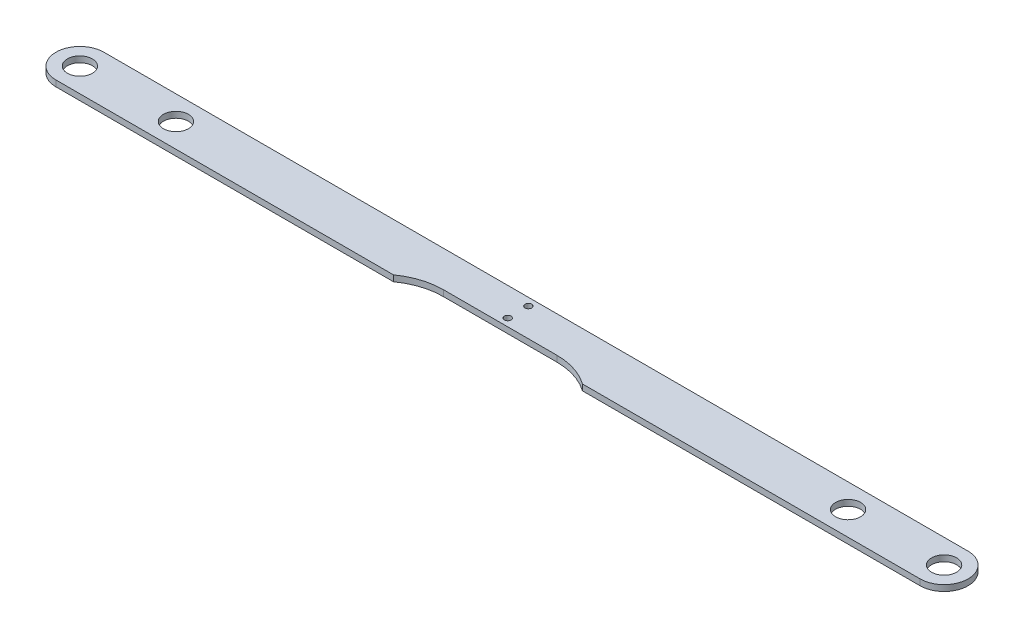
ISO-10303-21;
HEADER;
FILE_DESCRIPTION(('STEP AP214'),'2;1');
FILE_NAME('part.step','',(''),(''),'','','');
FILE_SCHEMA(('AUTOMOTIVE_DESIGN { 1 0 10303 214 1 1 1 1 }'));
ENDSEC;
DATA;
#1=APPLICATION_CONTEXT('core data for automotive mechanical design processes');
#2=APPLICATION_PROTOCOL_DEFINITION('international standard','automotive_design',2000,#1);
#3=PRODUCT_CONTEXT('',#1,'mechanical');
#4=PRODUCT('Part','Part','',(#3));
#5=PRODUCT_RELATED_PRODUCT_CATEGORY('part','',(#4));
#6=PRODUCT_DEFINITION_FORMATION('','',#4);
#7=PRODUCT_DEFINITION_CONTEXT('part definition',#1,'design');
#8=PRODUCT_DEFINITION('design','',#6,#7);
#9=PRODUCT_DEFINITION_SHAPE('','',#8);
#10=(LENGTH_UNIT() NAMED_UNIT(*) SI_UNIT(.MILLI.,.METRE.));
#11=(NAMED_UNIT(*) PLANE_ANGLE_UNIT() SI_UNIT($,.RADIAN.));
#12=(NAMED_UNIT(*) SI_UNIT($,.STERADIAN.) SOLID_ANGLE_UNIT());
#13=UNCERTAINTY_MEASURE_WITH_UNIT(LENGTH_MEASURE(1.E-05),#10,'distance_accuracy_value','');
#14=(GEOMETRIC_REPRESENTATION_CONTEXT(3) GLOBAL_UNCERTAINTY_ASSIGNED_CONTEXT((#13)) GLOBAL_UNIT_ASSIGNED_CONTEXT((#10,
#11,#12)) REPRESENTATION_CONTEXT('',''));
#15=CARTESIAN_POINT('',(0.,0.,0.));
#16=DIRECTION('',(0.,0.,1.));
#17=DIRECTION('',(1.,0.,0.));
#18=AXIS2_PLACEMENT_3D('',#15,#16,#17);
#19=CARTESIAN_POINT('',(-114.3,1.5875,1.60000000000002));
#20=DIRECTION('',(0.,1.,0.));
#21=DIRECTION('',(0.,0.,1.));
#22=AXIS2_PLACEMENT_3D('',#19,#20,#21);
#23=PLANE('',#22);
#24=CARTESIAN_POINT('',(0.,1.5875,-2.75));
#25=DIRECTION('',(0.,1.,0.));
#26=DIRECTION('',(0.,0.,1.));
#27=AXIS2_PLACEMENT_3D('',#24,#25,#26);
#28=CIRCLE('',#27,0.89);
#29=CARTESIAN_POINT('',(0.,1.5875,-1.86));
#30=VERTEX_POINT('',#29);
#31=EDGE_CURVE('E354',#30,#30,#28,.T.);
#32=ORIENTED_EDGE('',*,*,#31,.F.);
#33=EDGE_LOOP('',(#32));
#34=FACE_BOUND('',#33,.T.);
#35=CARTESIAN_POINT('',(0.,1.5875,2.75));
#36=DIRECTION('',(0.,1.,0.));
#37=DIRECTION('',(0.,0.,1.));
#38=AXIS2_PLACEMENT_3D('',#35,#36,#37);
#39=CIRCLE('',#38,0.89);
#40=CARTESIAN_POINT('',(0.,1.5875,3.64));
#41=VERTEX_POINT('',#40);
#42=EDGE_CURVE('E358',#41,#41,#39,.T.);
#43=ORIENTED_EDGE('',*,*,#42,.F.);
#44=EDGE_LOOP('',(#43));
#45=FACE_BOUND('',#44,.T.);
#46=CARTESIAN_POINT('',(-88.9,1.5875,1.60000000000002));
#47=DIRECTION('',(0.,1.,0.));
#48=DIRECTION('',(0.,0.,1.));
#49=AXIS2_PLACEMENT_3D('',#46,#47,#48);
#50=CIRCLE('',#49,3.302);
#51=CARTESIAN_POINT('',(-88.9,1.5875,4.90200000000002));
#52=VERTEX_POINT('',#51);
#53=EDGE_CURVE('E156',#52,#52,#50,.T.);
#54=ORIENTED_EDGE('',*,*,#53,.F.);
#55=EDGE_LOOP('',(#54));
#56=FACE_BOUND('',#55,.T.);
#57=CARTESIAN_POINT('',(-114.3,1.5875,1.60000000000002));
#58=DIRECTION('',(0.,1.,0.));
#59=DIRECTION('',(0.,0.,1.));
#60=AXIS2_PLACEMENT_3D('',#57,#58,#59);
#61=CIRCLE('',#60,6.35000000000001);
#62=CARTESIAN_POINT('',(-114.3,1.5875,-4.74999999999999));
#63=VERTEX_POINT('',#62);
#64=CARTESIAN_POINT('',(-114.3,1.5875,7.95000000000003));
#65=VERTEX_POINT('',#64);
#66=EDGE_CURVE('E162',#63,#65,#61,.T.);
#67=ORIENTED_EDGE('',*,*,#66,.T.);
#68=DIRECTION('',(1.,0.,0.));
#69=VECTOR('',#68,1.);
#70=CARTESIAN_POINT('',(-114.3,1.5875,7.95000000000003));
#71=LINE('',#70,#69);
#72=CARTESIAN_POINT('',(-25.,1.5875,7.94999999999997));
#73=VERTEX_POINT('',#72);
#74=EDGE_CURVE('E83',#65,#73,#71,.T.);
#75=ORIENTED_EDGE('',*,*,#74,.T.);
#76=CARTESIAN_POINT('',(-15.,1.5875,21.9750000000003));
#77=DIRECTION('',(0.,-1.,0.));
#78=DIRECTION('',(0.,0.,1.));
#79=AXIS2_PLACEMENT_3D('',#76,#77,#78);
#80=CIRCLE('',#79,17.2250000000003);
#81=CARTESIAN_POINT('',(-15.,1.5875,4.75000000000001));
#82=VERTEX_POINT('',#81);
#83=EDGE_CURVE('E165',#73,#82,#80,.T.);
#84=ORIENTED_EDGE('',*,*,#83,.T.);
#85=DIRECTION('',(1.,0.,0.));
#86=VECTOR('',#85,1.);
#87=CARTESIAN_POINT('',(-15.,1.5875,4.75000000000001));
#88=LINE('',#87,#86);
#89=CARTESIAN_POINT('',(15.,1.5875,4.75000000000001));
#90=VERTEX_POINT('',#89);
#91=EDGE_CURVE('E111',#82,#90,#88,.T.);
#92=ORIENTED_EDGE('',*,*,#91,.T.);
#93=CARTESIAN_POINT('',(15.,1.5875,21.9750000000003));
#94=DIRECTION('',(0.,1.,0.));
#95=DIRECTION('',(0.,0.,1.));
#96=AXIS2_PLACEMENT_3D('',#93,#94,#95);
#97=CIRCLE('',#96,17.2250000000003);
#98=CARTESIAN_POINT('',(25.,1.5875,7.94999999999997));
#99=VERTEX_POINT('',#98);
#100=EDGE_CURVE('E127',#99,#90,#97,.T.);
#101=ORIENTED_EDGE('',*,*,#100,.F.);
#102=DIRECTION('',(-1.,0.,0.));
#103=VECTOR('',#102,1.);
#104=CARTESIAN_POINT('',(114.3,1.5875,7.95000000000003));
#105=LINE('',#104,#103);
#106=CARTESIAN_POINT('',(114.3,1.5875,7.95000000000003));
#107=VERTEX_POINT('',#106);
#108=EDGE_CURVE('E126',#107,#99,#105,.T.);
#109=ORIENTED_EDGE('',*,*,#108,.F.);
#110=CARTESIAN_POINT('',(114.3,1.5875,1.60000000000002));
#111=DIRECTION('',(0.,-1.,0.));
#112=DIRECTION('',(0.,0.,1.));
#113=AXIS2_PLACEMENT_3D('',#110,#111,#112);
#114=CIRCLE('',#113,6.35000000000001);
#115=CARTESIAN_POINT('',(114.3,1.5875,-4.74999999999999));
#116=VERTEX_POINT('',#115);
#117=EDGE_CURVE('E116',#116,#107,#114,.T.);
#118=ORIENTED_EDGE('',*,*,#117,.F.);
#119=DIRECTION('',(-1.,0.,0.));
#120=VECTOR('',#119,1.);
#121=CARTESIAN_POINT('',(0.,1.5875,-4.74999999999999));
#122=LINE('',#121,#120);
#123=EDGE_CURVE('E50',#116,#63,#122,.T.);
#124=ORIENTED_EDGE('',*,*,#123,.T.);
#125=EDGE_LOOP('',(#67,#75,#84,#92,#101,#109,#118,#124));
#126=FACE_BOUND('',#125,.T.);
#127=CARTESIAN_POINT('',(-114.3,1.5875,1.60000000000002));
#128=DIRECTION('',(0.,1.,0.));
#129=DIRECTION('',(0.,0.,1.));
#130=AXIS2_PLACEMENT_3D('',#127,#128,#129);
#131=CIRCLE('',#130,3.302);
#132=CARTESIAN_POINT('',(-114.3,1.5875,4.90200000000002));
#133=VERTEX_POINT('',#132);
#134=EDGE_CURVE('E150',#133,#133,#131,.T.);
#135=ORIENTED_EDGE('',*,*,#134,.F.);
#136=EDGE_LOOP('',(#135));
#137=FACE_BOUND('',#136,.T.);
#138=CARTESIAN_POINT('',(114.3,1.5875,1.60000000000002));
#139=DIRECTION('',(0.,-1.,0.));
#140=DIRECTION('',(0.,0.,1.));
#141=AXIS2_PLACEMENT_3D('',#138,#139,#140);
#142=CIRCLE('',#141,3.302);
#143=CARTESIAN_POINT('',(114.3,1.5875,4.90200000000002));
#144=VERTEX_POINT('',#143);
#145=EDGE_CURVE('E368',#144,#144,#142,.T.);
#146=ORIENTED_EDGE('',*,*,#145,.T.);
#147=EDGE_LOOP('',(#146));
#148=FACE_BOUND('',#147,.T.);
#149=CARTESIAN_POINT('',(88.9,1.5875,1.60000000000002));
#150=DIRECTION('',(0.,-1.,0.));
#151=DIRECTION('',(0.,0.,1.));
#152=AXIS2_PLACEMENT_3D('',#149,#150,#151);
#153=CIRCLE('',#152,3.302);
#154=CARTESIAN_POINT('',(88.9,1.5875,4.90200000000002));
#155=VERTEX_POINT('',#154);
#156=EDGE_CURVE('E142',#155,#155,#153,.T.);
#157=ORIENTED_EDGE('',*,*,#156,.T.);
#158=EDGE_LOOP('',(#157));
#159=FACE_BOUND('',#158,.T.);
#160=ADVANCED_FACE('F33',(#34,#45,#56,#126,#137,#148,#159),#23,.T.);
#161=CARTESIAN_POINT('',(-114.3,0.,1.60000000000002));
#162=DIRECTION('',(0.,1.,0.));
#163=DIRECTION('',(0.,0.,1.));
#164=AXIS2_PLACEMENT_3D('',#161,#162,#163);
#165=PLANE('',#164);
#166=CARTESIAN_POINT('',(0.,0.,-2.75));
#167=DIRECTION('',(0.,1.,0.));
#168=DIRECTION('',(0.,0.,1.));
#169=AXIS2_PLACEMENT_3D('',#166,#167,#168);
#170=CIRCLE('',#169,0.89);
#171=CARTESIAN_POINT('',(0.,0.,-1.86));
#172=VERTEX_POINT('',#171);
#173=EDGE_CURVE('E357',#172,#172,#170,.T.);
#174=ORIENTED_EDGE('',*,*,#173,.T.);
#175=EDGE_LOOP('',(#174));
#176=FACE_BOUND('',#175,.T.);
#177=CARTESIAN_POINT('',(0.,0.,2.75));
#178=DIRECTION('',(0.,1.,0.));
#179=DIRECTION('',(0.,0.,1.));
#180=AXIS2_PLACEMENT_3D('',#177,#178,#179);
#181=CIRCLE('',#180,0.89);
#182=CARTESIAN_POINT('',(0.,0.,3.64));
#183=VERTEX_POINT('',#182);
#184=EDGE_CURVE('E363',#183,#183,#181,.T.);
#185=ORIENTED_EDGE('',*,*,#184,.T.);
#186=EDGE_LOOP('',(#185));
#187=FACE_BOUND('',#186,.T.);
#188=CARTESIAN_POINT('',(-114.3,0.,1.60000000000002));
#189=DIRECTION('',(0.,1.,0.));
#190=DIRECTION('',(0.,0.,1.));
#191=AXIS2_PLACEMENT_3D('',#188,#189,#190);
#192=CIRCLE('',#191,6.35000000000001);
#193=CARTESIAN_POINT('',(-114.3,0.,-4.74999999999999));
#194=VERTEX_POINT('',#193);
#195=CARTESIAN_POINT('',(-114.3,0.,7.95000000000003));
#196=VERTEX_POINT('',#195);
#197=EDGE_CURVE('E159',#194,#196,#192,.T.);
#198=ORIENTED_EDGE('',*,*,#197,.F.);
#199=DIRECTION('',(-1.,0.,0.));
#200=VECTOR('',#199,1.);
#201=CARTESIAN_POINT('',(0.,0.,-4.74999999999999));
#202=LINE('',#201,#200);
#203=CARTESIAN_POINT('',(114.3,0.,-4.74999999999999));
#204=VERTEX_POINT('',#203);
#205=EDGE_CURVE('E76',#204,#194,#202,.T.);
#206=ORIENTED_EDGE('',*,*,#205,.F.);
#207=CARTESIAN_POINT('',(114.3,0.,1.60000000000002));
#208=DIRECTION('',(0.,-1.,0.));
#209=DIRECTION('',(0.,0.,1.));
#210=AXIS2_PLACEMENT_3D('',#207,#208,#209);
#211=CIRCLE('',#210,6.35000000000001);
#212=CARTESIAN_POINT('',(114.3,0.,7.95000000000003));
#213=VERTEX_POINT('',#212);
#214=EDGE_CURVE('E119',#204,#213,#211,.T.);
#215=ORIENTED_EDGE('',*,*,#214,.T.);
#216=DIRECTION('',(-1.,0.,0.));
#217=VECTOR('',#216,1.);
#218=CARTESIAN_POINT('',(114.3,0.,7.95000000000003));
#219=LINE('',#218,#217);
#220=CARTESIAN_POINT('',(25.,0.,7.94999999999997));
#221=VERTEX_POINT('',#220);
#222=EDGE_CURVE('E128',#213,#221,#219,.T.);
#223=ORIENTED_EDGE('',*,*,#222,.T.);
#224=CARTESIAN_POINT('',(15.,0.,21.9750000000003));
#225=DIRECTION('',(0.,1.,0.));
#226=DIRECTION('',(0.,0.,1.));
#227=AXIS2_PLACEMENT_3D('',#224,#225,#226);
#228=CIRCLE('',#227,17.2250000000003);
#229=CARTESIAN_POINT('',(15.,0.,4.75000000000001));
#230=VERTEX_POINT('',#229);
#231=EDGE_CURVE('E133',#221,#230,#228,.T.);
#232=ORIENTED_EDGE('',*,*,#231,.T.);
#233=DIRECTION('',(1.,0.,0.));
#234=VECTOR('',#233,1.);
#235=CARTESIAN_POINT('',(-15.,0.,4.75000000000001));
#236=LINE('',#235,#234);
#237=CARTESIAN_POINT('',(-15.,0.,4.75000000000001));
#238=VERTEX_POINT('',#237);
#239=EDGE_CURVE('E173',#238,#230,#236,.T.);
#240=ORIENTED_EDGE('',*,*,#239,.F.);
#241=CARTESIAN_POINT('',(-15.,0.,21.9750000000003));
#242=DIRECTION('',(0.,-1.,0.));
#243=DIRECTION('',(0.,0.,1.));
#244=AXIS2_PLACEMENT_3D('',#241,#242,#243);
#245=CIRCLE('',#244,17.2250000000003);
#246=CARTESIAN_POINT('',(-25.,0.,7.94999999999997));
#247=VERTEX_POINT('',#246);
#248=EDGE_CURVE('E69',#247,#238,#245,.T.);
#249=ORIENTED_EDGE('',*,*,#248,.F.);
#250=DIRECTION('',(1.,0.,0.));
#251=VECTOR('',#250,1.);
#252=CARTESIAN_POINT('',(-114.3,0.,7.95000000000003));
#253=LINE('',#252,#251);
#254=EDGE_CURVE('E170',#196,#247,#253,.T.);
#255=ORIENTED_EDGE('',*,*,#254,.F.);
#256=EDGE_LOOP('',(#198,#206,#215,#223,#232,#240,#249,#255));
#257=FACE_BOUND('',#256,.T.);
#258=CARTESIAN_POINT('',(-88.9,0.,1.60000000000002));
#259=DIRECTION('',(0.,1.,0.));
#260=DIRECTION('',(0.,0.,1.));
#261=AXIS2_PLACEMENT_3D('',#258,#259,#260);
#262=CIRCLE('',#261,3.302);
#263=CARTESIAN_POINT('',(-88.9,0.,4.90200000000002));
#264=VERTEX_POINT('',#263);
#265=EDGE_CURVE('E153',#264,#264,#262,.T.);
#266=ORIENTED_EDGE('',*,*,#265,.T.);
#267=EDGE_LOOP('',(#266));
#268=FACE_BOUND('',#267,.T.);
#269=CARTESIAN_POINT('',(-114.3,0.,1.60000000000002));
#270=DIRECTION('',(0.,1.,0.));
#271=DIRECTION('',(0.,0.,1.));
#272=AXIS2_PLACEMENT_3D('',#269,#270,#271);
#273=CIRCLE('',#272,3.302);
#274=CARTESIAN_POINT('',(-114.3,0.,4.90200000000002));
#275=VERTEX_POINT('',#274);
#276=EDGE_CURVE('E120',#275,#275,#273,.T.);
#277=ORIENTED_EDGE('',*,*,#276,.T.);
#278=EDGE_LOOP('',(#277));
#279=FACE_BOUND('',#278,.T.);
#280=CARTESIAN_POINT('',(114.3,0.,1.60000000000002));
#281=DIRECTION('',(0.,-1.,0.));
#282=DIRECTION('',(0.,0.,1.));
#283=AXIS2_PLACEMENT_3D('',#280,#281,#282);
#284=CIRCLE('',#283,3.302);
#285=CARTESIAN_POINT('',(114.3,0.,4.90200000000002));
#286=VERTEX_POINT('',#285);
#287=EDGE_CURVE('E360',#286,#286,#284,.T.);
#288=ORIENTED_EDGE('',*,*,#287,.F.);
#289=EDGE_LOOP('',(#288));
#290=FACE_BOUND('',#289,.T.);
#291=CARTESIAN_POINT('',(88.9,0.,1.60000000000002));
#292=DIRECTION('',(0.,-1.,0.));
#293=DIRECTION('',(0.,0.,1.));
#294=AXIS2_PLACEMENT_3D('',#291,#292,#293);
#295=CIRCLE('',#294,3.302);
#296=CARTESIAN_POINT('',(88.9,0.,4.90200000000002));
#297=VERTEX_POINT('',#296);
#298=EDGE_CURVE('E136',#297,#297,#295,.T.);
#299=ORIENTED_EDGE('',*,*,#298,.F.);
#300=EDGE_LOOP('',(#299));
#301=FACE_BOUND('',#300,.T.);
#302=ADVANCED_FACE('F183',(#176,#187,#257,#268,#279,#290,#301),#165,.F.);
#303=CARTESIAN_POINT('',(-114.3,1.5875,1.60000000000002));
#304=DIRECTION('',(0.,-1.,0.));
#305=DIRECTION('',(0.,0.,-1.));
#306=AXIS2_PLACEMENT_3D('',#303,#304,#305);
#307=CYLINDRICAL_SURFACE('',#306,6.35000000000001);
#308=ORIENTED_EDGE('',*,*,#197,.T.);
#309=DIRECTION('',(0.,-1.,0.));
#310=VECTOR('',#309,1.);
#311=CARTESIAN_POINT('',(-114.3,1.5875,7.95000000000003));
#312=LINE('',#311,#310);
#313=EDGE_CURVE('E11',#65,#196,#312,.T.);
#314=ORIENTED_EDGE('',*,*,#313,.F.);
#315=ORIENTED_EDGE('',*,*,#66,.F.);
#316=DIRECTION('',(0.,-1.,0.));
#317=VECTOR('',#316,1.);
#318=CARTESIAN_POINT('',(-114.3,1.5875,-4.74999999999999));
#319=LINE('',#318,#317);
#320=EDGE_CURVE('E109',#63,#194,#319,.T.);
#321=ORIENTED_EDGE('',*,*,#320,.T.);
#322=EDGE_LOOP('',(#308,#314,#315,#321));
#323=FACE_BOUND('',#322,.T.);
#324=ADVANCED_FACE('F35',(#323),#307,.T.);
#325=CARTESIAN_POINT('',(-114.3,1.5875,7.95000000000003));
#326=DIRECTION('',(0.,0.,-1.));
#327=DIRECTION('',(-1.,0.,0.));
#328=AXIS2_PLACEMENT_3D('',#325,#326,#327);
#329=PLANE('',#328);
#330=ORIENTED_EDGE('',*,*,#254,.T.);
#331=DIRECTION('',(0.,-1.,0.));
#332=VECTOR('',#331,1.);
#333=CARTESIAN_POINT('',(-25.,1.5875,7.94999999999997));
#334=LINE('',#333,#332);
#335=EDGE_CURVE('E42',#73,#247,#334,.T.);
#336=ORIENTED_EDGE('',*,*,#335,.F.);
#337=ORIENTED_EDGE('',*,*,#74,.F.);
#338=ORIENTED_EDGE('',*,*,#313,.T.);
#339=EDGE_LOOP('',(#330,#336,#337,#338));
#340=FACE_BOUND('',#339,.T.);
#341=ADVANCED_FACE('F197',(#340),#329,.F.);
#342=CARTESIAN_POINT('',(-15.,1.5875,21.9750000000003));
#343=DIRECTION('',(0.,-1.,0.));
#344=DIRECTION('',(0.,0.,-1.));
#345=AXIS2_PLACEMENT_3D('',#342,#343,#344);
#346=CYLINDRICAL_SURFACE('',#345,17.2250000000003);
#347=ORIENTED_EDGE('',*,*,#248,.T.);
#348=DIRECTION('',(0.,-1.,0.));
#349=VECTOR('',#348,1.);
#350=CARTESIAN_POINT('',(-15.,1.5875,4.75000000000001));
#351=LINE('',#350,#349);
#352=EDGE_CURVE('E177',#82,#238,#351,.T.);
#353=ORIENTED_EDGE('',*,*,#352,.F.);
#354=ORIENTED_EDGE('',*,*,#83,.F.);
#355=ORIENTED_EDGE('',*,*,#335,.T.);
#356=EDGE_LOOP('',(#347,#353,#354,#355));
#357=FACE_BOUND('',#356,.T.);
#358=ADVANCED_FACE('F179',(#357),#346,.F.);
#359=CARTESIAN_POINT('',(-15.,1.5875,4.75000000000001));
#360=DIRECTION('',(0.,0.,-1.));
#361=DIRECTION('',(-1.,0.,0.));
#362=AXIS2_PLACEMENT_3D('',#359,#360,#361);
#363=PLANE('',#362);
#364=ORIENTED_EDGE('',*,*,#239,.T.);
#365=DIRECTION('',(0.,-1.,0.));
#366=VECTOR('',#365,1.);
#367=CARTESIAN_POINT('',(15.,1.5875,4.75000000000001));
#368=LINE('',#367,#366);
#369=EDGE_CURVE('E121',#90,#230,#368,.T.);
#370=ORIENTED_EDGE('',*,*,#369,.F.);
#371=ORIENTED_EDGE('',*,*,#91,.F.);
#372=ORIENTED_EDGE('',*,*,#352,.T.);
#373=EDGE_LOOP('',(#364,#370,#371,#372));
#374=FACE_BOUND('',#373,.T.);
#375=ADVANCED_FACE('F188',(#374),#363,.F.);
#376=CARTESIAN_POINT('',(0.,1.5875,-4.74999999999999));
#377=DIRECTION('',(0.,0.,1.));
#378=DIRECTION('',(1.,0.,0.));
#379=AXIS2_PLACEMENT_3D('',#376,#377,#378);
#380=PLANE('',#379);
#381=ORIENTED_EDGE('',*,*,#205,.T.);
#382=ORIENTED_EDGE('',*,*,#320,.F.);
#383=ORIENTED_EDGE('',*,*,#123,.F.);
#384=DIRECTION('',(0.,-1.,0.));
#385=VECTOR('',#384,1.);
#386=CARTESIAN_POINT('',(114.3,1.5875,-4.74999999999999));
#387=LINE('',#386,#385);
#388=EDGE_CURVE('E107',#116,#204,#387,.T.);
#389=ORIENTED_EDGE('',*,*,#388,.T.);
#390=EDGE_LOOP('',(#381,#382,#383,#389));
#391=FACE_BOUND('',#390,.T.);
#392=ADVANCED_FACE('F106',(#391),#380,.F.);
#393=CARTESIAN_POINT('',(-88.9,1.5875,1.60000000000002));
#394=DIRECTION('',(0.,-1.,0.));
#395=DIRECTION('',(0.,0.,-1.));
#396=AXIS2_PLACEMENT_3D('',#393,#394,#395);
#397=CYLINDRICAL_SURFACE('',#396,3.302);
#398=ORIENTED_EDGE('',*,*,#53,.T.);
#399=EDGE_LOOP('',(#398));
#400=FACE_BOUND('',#399,.T.);
#401=ORIENTED_EDGE('',*,*,#265,.F.);
#402=EDGE_LOOP('',(#401));
#403=FACE_BOUND('',#402,.T.);
#404=ADVANCED_FACE('F215',(#400,#403),#397,.F.);
#405=CARTESIAN_POINT('',(-114.3,1.5875,1.60000000000002));
#406=DIRECTION('',(0.,-1.,0.));
#407=DIRECTION('',(0.,0.,-1.));
#408=AXIS2_PLACEMENT_3D('',#405,#406,#407);
#409=CYLINDRICAL_SURFACE('',#408,3.302);
#410=ORIENTED_EDGE('',*,*,#134,.T.);
#411=EDGE_LOOP('',(#410));
#412=FACE_BOUND('',#411,.T.);
#413=ORIENTED_EDGE('',*,*,#276,.F.);
#414=EDGE_LOOP('',(#413));
#415=FACE_BOUND('',#414,.T.);
#416=ADVANCED_FACE('F237',(#412,#415),#409,.F.);
#417=CARTESIAN_POINT('',(114.3,1.5875,1.60000000000002));
#418=DIRECTION('',(0.,-1.,0.));
#419=DIRECTION('',(0.,0.,-1.));
#420=AXIS2_PLACEMENT_3D('',#417,#418,#419);
#421=CYLINDRICAL_SURFACE('',#420,6.35000000000001);
#422=ORIENTED_EDGE('',*,*,#214,.F.);
#423=ORIENTED_EDGE('',*,*,#388,.F.);
#424=ORIENTED_EDGE('',*,*,#117,.T.);
#425=DIRECTION('',(0.,-1.,0.));
#426=VECTOR('',#425,1.);
#427=CARTESIAN_POINT('',(114.3,1.5875,7.95000000000003));
#428=LINE('',#427,#426);
#429=EDGE_CURVE('E140',#107,#213,#428,.T.);
#430=ORIENTED_EDGE('',*,*,#429,.T.);
#431=EDGE_LOOP('',(#422,#423,#424,#430));
#432=FACE_BOUND('',#431,.T.);
#433=ADVANCED_FACE('F115',(#432),#421,.T.);
#434=CARTESIAN_POINT('',(15.,1.5875,21.9750000000003));
#435=DIRECTION('',(0.,-1.,0.));
#436=DIRECTION('',(0.,0.,-1.));
#437=AXIS2_PLACEMENT_3D('',#434,#435,#436);
#438=CYLINDRICAL_SURFACE('',#437,17.2250000000003);
#439=ORIENTED_EDGE('',*,*,#231,.F.);
#440=DIRECTION('',(0.,-1.,0.));
#441=VECTOR('',#440,1.);
#442=CARTESIAN_POINT('',(25.,1.5875,7.94999999999997));
#443=LINE('',#442,#441);
#444=EDGE_CURVE('E146',#99,#221,#443,.T.);
#445=ORIENTED_EDGE('',*,*,#444,.F.);
#446=ORIENTED_EDGE('',*,*,#100,.T.);
#447=ORIENTED_EDGE('',*,*,#369,.T.);
#448=EDGE_LOOP('',(#439,#445,#446,#447));
#449=FACE_BOUND('',#448,.T.);
#450=ADVANCED_FACE('F191',(#449),#438,.F.);
#451=CARTESIAN_POINT('',(114.3,1.5875,7.95000000000003));
#452=DIRECTION('',(0.,0.,1.));
#453=DIRECTION('',(1.,0.,0.));
#454=AXIS2_PLACEMENT_3D('',#451,#452,#453);
#455=PLANE('',#454);
#456=ORIENTED_EDGE('',*,*,#222,.F.);
#457=ORIENTED_EDGE('',*,*,#429,.F.);
#458=ORIENTED_EDGE('',*,*,#108,.T.);
#459=ORIENTED_EDGE('',*,*,#444,.T.);
#460=EDGE_LOOP('',(#456,#457,#458,#459));
#461=FACE_BOUND('',#460,.T.);
#462=ADVANCED_FACE('F194',(#461),#455,.T.);
#463=CARTESIAN_POINT('',(88.9,1.5875,1.60000000000002));
#464=DIRECTION('',(0.,-1.,0.));
#465=DIRECTION('',(0.,0.,-1.));
#466=AXIS2_PLACEMENT_3D('',#463,#464,#465);
#467=CYLINDRICAL_SURFACE('',#466,3.302);
#468=ORIENTED_EDGE('',*,*,#156,.F.);
#469=EDGE_LOOP('',(#468));
#470=FACE_BOUND('',#469,.T.);
#471=ORIENTED_EDGE('',*,*,#298,.T.);
#472=EDGE_LOOP('',(#471));
#473=FACE_BOUND('',#472,.T.);
#474=ADVANCED_FACE('F260',(#470,#473),#467,.F.);
#475=CARTESIAN_POINT('',(114.3,1.5875,1.60000000000002));
#476=DIRECTION('',(0.,-1.,0.));
#477=DIRECTION('',(0.,0.,-1.));
#478=AXIS2_PLACEMENT_3D('',#475,#476,#477);
#479=CYLINDRICAL_SURFACE('',#478,3.302);
#480=ORIENTED_EDGE('',*,*,#145,.F.);
#481=EDGE_LOOP('',(#480));
#482=FACE_BOUND('',#481,.T.);
#483=ORIENTED_EDGE('',*,*,#287,.T.);
#484=EDGE_LOOP('',(#483));
#485=FACE_BOUND('',#484,.T.);
#486=ADVANCED_FACE('F267',(#482,#485),#479,.F.);
#487=CARTESIAN_POINT('',(0.,1.5875,2.75));
#488=DIRECTION('',(0.,-1.,0.));
#489=DIRECTION('',(0.,0.,-1.));
#490=AXIS2_PLACEMENT_3D('',#487,#488,#489);
#491=CYLINDRICAL_SURFACE('',#490,0.89);
#492=ORIENTED_EDGE('',*,*,#42,.T.);
#493=EDGE_LOOP('',(#492));
#494=FACE_BOUND('',#493,.T.);
#495=ORIENTED_EDGE('',*,*,#184,.F.);
#496=EDGE_LOOP('',(#495));
#497=FACE_BOUND('',#496,.T.);
#498=ADVANCED_FACE('F275',(#494,#497),#491,.F.);
#499=CARTESIAN_POINT('',(0.,1.5875,-2.75));
#500=DIRECTION('',(0.,-1.,0.));
#501=DIRECTION('',(0.,0.,-1.));
#502=AXIS2_PLACEMENT_3D('',#499,#500,#501);
#503=CYLINDRICAL_SURFACE('',#502,0.89);
#504=ORIENTED_EDGE('',*,*,#31,.T.);
#505=EDGE_LOOP('',(#504));
#506=FACE_BOUND('',#505,.T.);
#507=ORIENTED_EDGE('',*,*,#173,.F.);
#508=EDGE_LOOP('',(#507));
#509=FACE_BOUND('',#508,.T.);
#510=ADVANCED_FACE('F283',(#506,#509),#503,.F.);
#511=CLOSED_SHELL('',(#160,#302,#324,#341,#358,#375,#392,#404,#416,#433,#450,#462,#474,#486,
#498,#510));
#512=MANIFOLD_SOLID_BREP('B2',#511);
#513=ADVANCED_BREP_SHAPE_REPRESENTATION('',(#18,#512),#14);
#514=SHAPE_DEFINITION_REPRESENTATION(#9,#513);
ENDSEC;
END-ISO-10303-21;
